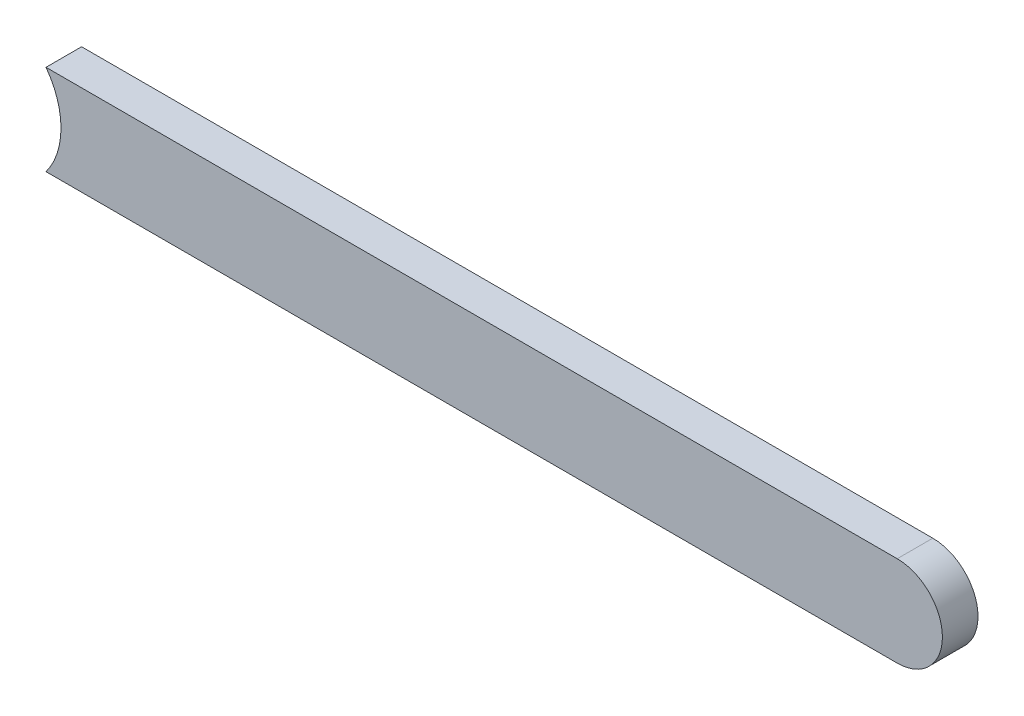
ISO-10303-21;
HEADER;
FILE_DESCRIPTION(('STEP AP214'),'2;1');
FILE_NAME('part.step','',(''),(''),'','','');
FILE_SCHEMA(('AUTOMOTIVE_DESIGN { 1 0 10303 214 1 1 1 1 }'));
ENDSEC;
DATA;
#1=APPLICATION_CONTEXT('core data for automotive mechanical design processes');
#2=APPLICATION_PROTOCOL_DEFINITION('international standard','automotive_design',2000,#1);
#3=PRODUCT_CONTEXT('',#1,'mechanical');
#4=PRODUCT('Part','Part','',(#3));
#5=PRODUCT_RELATED_PRODUCT_CATEGORY('part','',(#4));
#6=PRODUCT_DEFINITION_FORMATION('','',#4);
#7=PRODUCT_DEFINITION_CONTEXT('part definition',#1,'design');
#8=PRODUCT_DEFINITION('design','',#6,#7);
#9=PRODUCT_DEFINITION_SHAPE('','',#8);
#10=(LENGTH_UNIT() NAMED_UNIT(*) SI_UNIT(.MILLI.,.METRE.));
#11=(NAMED_UNIT(*) PLANE_ANGLE_UNIT() SI_UNIT($,.RADIAN.));
#12=(NAMED_UNIT(*) SI_UNIT($,.STERADIAN.) SOLID_ANGLE_UNIT());
#13=UNCERTAINTY_MEASURE_WITH_UNIT(LENGTH_MEASURE(1.E-05),#10,'distance_accuracy_value','');
#14=(GEOMETRIC_REPRESENTATION_CONTEXT(3) GLOBAL_UNCERTAINTY_ASSIGNED_CONTEXT((#13)) GLOBAL_UNIT_ASSIGNED_CONTEXT((#10,
#11,#12)) REPRESENTATION_CONTEXT('',''));
#15=CARTESIAN_POINT('',(0.,0.,0.));
#16=DIRECTION('',(0.,0.,1.));
#17=DIRECTION('',(1.,0.,0.));
#18=AXIS2_PLACEMENT_3D('',#15,#16,#17);
#19=CARTESIAN_POINT('',(103.801755431104,57.912,0.));
#20=DIRECTION('',(0.,1.,0.));
#21=DIRECTION('',(1.,0.,0.));
#22=AXIS2_PLACEMENT_3D('',#19,#20,#21);
#23=PLANE('',#22);
#24=DIRECTION('',(1.,0.,0.));
#25=VECTOR('',#24,1.);
#26=CARTESIAN_POINT('',(103.4610072,57.912,0.1999996));
#27=LINE('',#26,#25);
#28=CARTESIAN_POINT('',(103.801755431104,57.912,0.1999996));
#29=VERTEX_POINT('',#28);
#30=CARTESIAN_POINT('',(108.585,57.912,0.1999996));
#31=VERTEX_POINT('',#30);
#32=EDGE_CURVE('E11',#29,#31,#27,.T.);
#33=ORIENTED_EDGE('',*,*,#32,.F.);
#34=DIRECTION('',(0.,0.,1.));
#35=VECTOR('',#34,1.);
#36=CARTESIAN_POINT('',(103.801755431104,57.912,0.));
#37=LINE('',#36,#35);
#38=CARTESIAN_POINT('',(103.801755431104,57.912,0.));
#39=VERTEX_POINT('',#38);
#40=EDGE_CURVE('E24',#39,#29,#37,.T.);
#41=ORIENTED_EDGE('',*,*,#40,.F.);
#42=DIRECTION('',(1.,0.,0.));
#43=VECTOR('',#42,1.);
#44=CARTESIAN_POINT('',(103.4610072,57.912,0.));
#45=LINE('',#44,#43);
#46=CARTESIAN_POINT('',(108.585,57.912,0.));
#47=VERTEX_POINT('',#46);
#48=EDGE_CURVE('E82',#39,#47,#45,.T.);
#49=ORIENTED_EDGE('',*,*,#48,.T.);
#50=DIRECTION('',(0.,0.,1.));
#51=VECTOR('',#50,1.);
#52=CARTESIAN_POINT('',(108.585,57.912,0.));
#53=LINE('',#52,#51);
#54=EDGE_CURVE('E37',#47,#31,#53,.T.);
#55=ORIENTED_EDGE('',*,*,#54,.T.);
#56=EDGE_LOOP('',(#33,#41,#49,#55));
#57=FACE_BOUND('',#56,.T.);
#58=ADVANCED_FACE('F17',(#57),#23,.F.);
#59=CARTESIAN_POINT('',(108.585,58.166,0.));
#60=DIRECTION('',(0.,0.,-1.));
#61=DIRECTION('',(0.,-1.,0.));
#62=AXIS2_PLACEMENT_3D('',#59,#60,#61);
#63=CYLINDRICAL_SURFACE('',#62,0.254000000000003);
#64=CARTESIAN_POINT('',(108.585,58.166,0.1999996));
#65=DIRECTION('',(0.,0.,1.));
#66=DIRECTION('',(0.,-1.,0.));
#67=AXIS2_PLACEMENT_3D('',#64,#65,#66);
#68=CIRCLE('',#67,0.254000000000003);
#69=CARTESIAN_POINT('',(108.585,58.42,0.1999996));
#70=VERTEX_POINT('',#69);
#71=EDGE_CURVE('E97',#31,#70,#68,.T.);
#72=ORIENTED_EDGE('',*,*,#71,.F.);
#73=ORIENTED_EDGE('',*,*,#54,.F.);
#74=CARTESIAN_POINT('',(108.585,58.166,0.));
#75=DIRECTION('',(0.,0.,1.));
#76=DIRECTION('',(0.,-1.,0.));
#77=AXIS2_PLACEMENT_3D('',#74,#75,#76);
#78=CIRCLE('',#77,0.254000000000003);
#79=CARTESIAN_POINT('',(108.585,58.42,0.));
#80=VERTEX_POINT('',#79);
#81=EDGE_CURVE('E94',#47,#80,#78,.T.);
#82=ORIENTED_EDGE('',*,*,#81,.T.);
#83=DIRECTION('',(0.,0.,1.));
#84=VECTOR('',#83,1.);
#85=CARTESIAN_POINT('',(108.585,58.42,0.));
#86=LINE('',#85,#84);
#87=EDGE_CURVE('E92',#80,#70,#86,.T.);
#88=ORIENTED_EDGE('',*,*,#87,.T.);
#89=EDGE_LOOP('',(#72,#73,#82,#88));
#90=FACE_BOUND('',#89,.T.);
#91=ADVANCED_FACE('F103',(#90),#63,.T.);
#92=CARTESIAN_POINT('',(108.585,58.42,0.));
#93=DIRECTION('',(0.,-1.,0.));
#94=DIRECTION('',(-1.,0.,0.));
#95=AXIS2_PLACEMENT_3D('',#92,#93,#94);
#96=PLANE('',#95);
#97=DIRECTION('',(-1.,0.,0.));
#98=VECTOR('',#97,1.);
#99=CARTESIAN_POINT('',(108.585,58.42,0.1999996));
#100=LINE('',#99,#98);
#101=CARTESIAN_POINT('',(103.801755431104,58.42,0.1999996));
#102=VERTEX_POINT('',#101);
#103=EDGE_CURVE('E89',#70,#102,#100,.T.);
#104=ORIENTED_EDGE('',*,*,#103,.F.);
#105=ORIENTED_EDGE('',*,*,#87,.F.);
#106=DIRECTION('',(-1.,0.,0.));
#107=VECTOR('',#106,1.);
#108=CARTESIAN_POINT('',(108.585,58.42,0.));
#109=LINE('',#108,#107);
#110=CARTESIAN_POINT('',(103.801755431104,58.42,0.));
#111=VERTEX_POINT('',#110);
#112=EDGE_CURVE('E87',#80,#111,#109,.T.);
#113=ORIENTED_EDGE('',*,*,#112,.T.);
#114=DIRECTION('',(0.,0.,1.));
#115=VECTOR('',#114,1.);
#116=CARTESIAN_POINT('',(103.801755431104,58.42,0.));
#117=LINE('',#116,#115);
#118=EDGE_CURVE('E69',#111,#102,#117,.T.);
#119=ORIENTED_EDGE('',*,*,#118,.T.);
#120=EDGE_LOOP('',(#104,#105,#113,#119));
#121=FACE_BOUND('',#120,.T.);
#122=ADVANCED_FACE('F108',(#121),#96,.F.);
#123=CARTESIAN_POINT('',(103.4610072,58.166,0.));
#124=DIRECTION('',(0.,0.,-1.));
#125=DIRECTION('',(1.,0.,0.));
#126=AXIS2_PLACEMENT_3D('',#123,#124,#125);
#127=CYLINDRICAL_SURFACE('',#126,0.42500042);
#128=DIRECTION('',(0.,0.,1.));
#129=VECTOR('',#128,1.);
#130=CARTESIAN_POINT('',(103.88600762,58.166,0.));
#131=LINE('',#130,#129);
#132=CARTESIAN_POINT('',(103.88600762,58.166,0.));
#133=VERTEX_POINT('',#132);
#134=CARTESIAN_POINT('',(103.88600762,58.166,0.1999996));
#135=VERTEX_POINT('',#134);
#136=EDGE_CURVE('E59',#133,#135,#131,.T.);
#137=ORIENTED_EDGE('',*,*,#136,.T.);
#138=CARTESIAN_POINT('',(103.4610072,58.166,0.1999996));
#139=DIRECTION('',(0.,0.,1.));
#140=DIRECTION('',(1.,0.,0.));
#141=AXIS2_PLACEMENT_3D('',#138,#139,#140);
#142=CIRCLE('',#141,0.42500042);
#143=EDGE_CURVE('E70',#135,#102,#142,.T.);
#144=ORIENTED_EDGE('',*,*,#143,.T.);
#145=ORIENTED_EDGE('',*,*,#118,.F.);
#146=CARTESIAN_POINT('',(103.4610072,58.166,0.));
#147=DIRECTION('',(0.,0.,1.));
#148=DIRECTION('',(1.,0.,0.));
#149=AXIS2_PLACEMENT_3D('',#146,#147,#148);
#150=CIRCLE('',#149,0.42500042);
#151=EDGE_CURVE('E73',#133,#111,#150,.T.);
#152=ORIENTED_EDGE('',*,*,#151,.F.);
#153=EDGE_LOOP('',(#137,#144,#145,#152));
#154=FACE_BOUND('',#153,.T.);
#155=ADVANCED_FACE('F74',(#154),#127,.F.);
#156=CARTESIAN_POINT('',(103.4610072,58.166,0.));
#157=DIRECTION('',(0.,0.,-1.));
#158=DIRECTION('',(1.,0.,0.));
#159=AXIS2_PLACEMENT_3D('',#156,#157,#158);
#160=CYLINDRICAL_SURFACE('',#159,0.42500042);
#161=ORIENTED_EDGE('',*,*,#40,.T.);
#162=CARTESIAN_POINT('',(103.4610072,58.166,0.1999996));
#163=DIRECTION('',(0.,0.,1.));
#164=DIRECTION('',(1.,0.,0.));
#165=AXIS2_PLACEMENT_3D('',#162,#163,#164);
#166=CIRCLE('',#165,0.42500042);
#167=EDGE_CURVE('E65',#29,#135,#166,.T.);
#168=ORIENTED_EDGE('',*,*,#167,.T.);
#169=ORIENTED_EDGE('',*,*,#136,.F.);
#170=EDGE_CURVE('E63',#39,#133,#150,.T.);
#171=ORIENTED_EDGE('',*,*,#170,.F.);
#172=EDGE_LOOP('',(#161,#168,#169,#171));
#173=FACE_BOUND('',#172,.T.);
#174=ADVANCED_FACE('F61',(#173),#160,.F.);
#175=CARTESIAN_POINT('',(103.4610072,57.912,0.));
#176=DIRECTION('',(0.,0.,-1.));
#177=DIRECTION('',(-1.,0.,0.));
#178=AXIS2_PLACEMENT_3D('',#175,#176,#177);
#179=PLANE('',#178);
#180=ORIENTED_EDGE('',*,*,#48,.F.);
#181=ORIENTED_EDGE('',*,*,#170,.T.);
#182=ORIENTED_EDGE('',*,*,#151,.T.);
#183=ORIENTED_EDGE('',*,*,#112,.F.);
#184=ORIENTED_EDGE('',*,*,#81,.F.);
#185=EDGE_LOOP('',(#180,#181,#182,#183,#184));
#186=FACE_BOUND('',#185,.T.);
#187=ADVANCED_FACE('F80',(#186),#179,.T.);
#188=CARTESIAN_POINT('',(103.4610072,57.912,0.1999996));
#189=DIRECTION('',(0.,0.,-1.));
#190=DIRECTION('',(-1.,0.,0.));
#191=AXIS2_PLACEMENT_3D('',#188,#189,#190);
#192=PLANE('',#191);
#193=ORIENTED_EDGE('',*,*,#167,.F.);
#194=ORIENTED_EDGE('',*,*,#32,.T.);
#195=ORIENTED_EDGE('',*,*,#71,.T.);
#196=ORIENTED_EDGE('',*,*,#103,.T.);
#197=ORIENTED_EDGE('',*,*,#143,.F.);
#198=EDGE_LOOP('',(#193,#194,#195,#196,#197));
#199=FACE_BOUND('',#198,.T.);
#200=ADVANCED_FACE('F106',(#199),#192,.F.);
#201=CLOSED_SHELL('',(#58,#91,#122,#155,#174,#187,#200));
#202=MANIFOLD_SOLID_BREP('B1',#201);
#203=ADVANCED_BREP_SHAPE_REPRESENTATION('',(#18,#202),#14);
#204=SHAPE_DEFINITION_REPRESENTATION(#9,#203);
ENDSEC;
END-ISO-10303-21;
